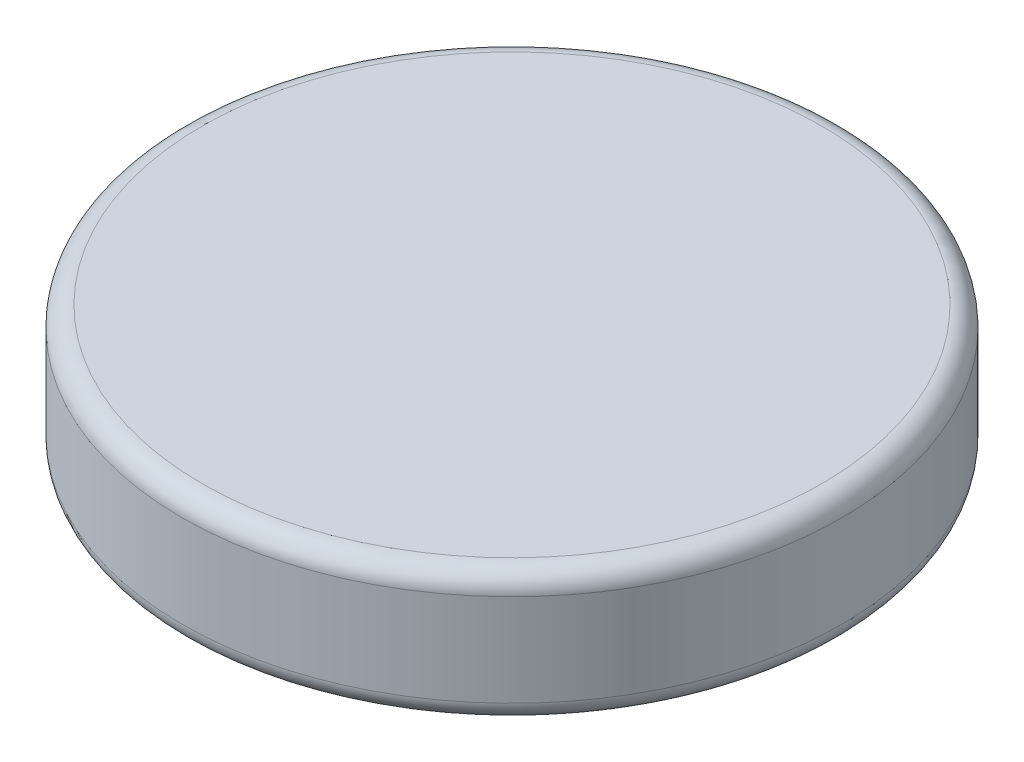
ISO-10303-21;
HEADER;
FILE_DESCRIPTION(('STEP AP214'),'2;1');
FILE_NAME('part.step','',(''),(''),'','','');
FILE_SCHEMA(('AUTOMOTIVE_DESIGN { 1 0 10303 214 1 1 1 1 }'));
ENDSEC;
DATA;
#1=APPLICATION_CONTEXT('core data for automotive mechanical design processes');
#2=APPLICATION_PROTOCOL_DEFINITION('international standard','automotive_design',2000,#1);
#3=PRODUCT_CONTEXT('',#1,'mechanical');
#4=PRODUCT('Part','Part','',(#3));
#5=PRODUCT_RELATED_PRODUCT_CATEGORY('part','',(#4));
#6=PRODUCT_DEFINITION_FORMATION('','',#4);
#7=PRODUCT_DEFINITION_CONTEXT('part definition',#1,'design');
#8=PRODUCT_DEFINITION('design','',#6,#7);
#9=PRODUCT_DEFINITION_SHAPE('','',#8);
#10=(LENGTH_UNIT() NAMED_UNIT(*) SI_UNIT(.MILLI.,.METRE.));
#11=(NAMED_UNIT(*) PLANE_ANGLE_UNIT() SI_UNIT($,.RADIAN.));
#12=(NAMED_UNIT(*) SI_UNIT($,.STERADIAN.) SOLID_ANGLE_UNIT());
#13=UNCERTAINTY_MEASURE_WITH_UNIT(LENGTH_MEASURE(1.E-05),#10,'distance_accuracy_value','');
#14=(GEOMETRIC_REPRESENTATION_CONTEXT(3) GLOBAL_UNCERTAINTY_ASSIGNED_CONTEXT((#13)) GLOBAL_UNIT_ASSIGNED_CONTEXT((#10,
#11,#12)) REPRESENTATION_CONTEXT('',''));
#15=CARTESIAN_POINT('',(0.,0.,0.));
#16=DIRECTION('',(0.,0.,1.));
#17=DIRECTION('',(1.,0.,0.));
#18=AXIS2_PLACEMENT_3D('',#15,#16,#17);
#19=CARTESIAN_POINT('',(0.,2.,0.));
#20=DIRECTION('',(0.,-1.,0.));
#21=DIRECTION('',(0.,0.,-1.));
#22=AXIS2_PLACEMENT_3D('',#19,#20,#21);
#23=CYLINDRICAL_SURFACE('',#22,5.);
#24=CARTESIAN_POINT('',(0.,0.3,0.));
#25=DIRECTION('',(0.,1.,0.));
#26=DIRECTION('',(0.,0.,1.));
#27=AXIS2_PLACEMENT_3D('',#24,#25,#26);
#28=CIRCLE('',#27,5.);
#29=CARTESIAN_POINT('',(0.,0.3,5.));
#30=VERTEX_POINT('',#29);
#31=EDGE_CURVE('E37',#30,#30,#28,.T.);
#32=ORIENTED_EDGE('',*,*,#31,.T.);
#33=EDGE_LOOP('',(#32));
#34=FACE_BOUND('',#33,.T.);
#35=CARTESIAN_POINT('',(0.,1.7,0.));
#36=DIRECTION('',(0.,1.,0.));
#37=DIRECTION('',(0.,0.,1.));
#38=AXIS2_PLACEMENT_3D('',#35,#36,#37);
#39=CIRCLE('',#38,5.);
#40=CARTESIAN_POINT('',(0.,1.7,5.));
#41=VERTEX_POINT('',#40);
#42=EDGE_CURVE('E41',#41,#41,#39,.F.);
#43=ORIENTED_EDGE('',*,*,#42,.T.);
#44=EDGE_LOOP('',(#43));
#45=FACE_BOUND('',#44,.T.);
#46=ADVANCED_FACE('F30',(#34,#45),#23,.T.);
#47=CARTESIAN_POINT('',(0.,2.,0.));
#48=DIRECTION('',(0.,1.,0.));
#49=DIRECTION('',(0.,0.,1.));
#50=AXIS2_PLACEMENT_3D('',#47,#48,#49);
#51=PLANE('',#50);
#52=CARTESIAN_POINT('',(0.,2.,0.));
#53=DIRECTION('',(0.,1.,0.));
#54=DIRECTION('',(0.,0.,1.));
#55=AXIS2_PLACEMENT_3D('',#52,#53,#54);
#56=CIRCLE('',#55,4.7);
#57=CARTESIAN_POINT('',(0.,2.,4.7));
#58=VERTEX_POINT('',#57);
#59=EDGE_CURVE('E45',#58,#58,#56,.T.);
#60=ORIENTED_EDGE('',*,*,#59,.T.);
#61=EDGE_LOOP('',(#60));
#62=FACE_BOUND('',#61,.T.);
#63=ADVANCED_FACE('F51',(#62),#51,.T.);
#64=CARTESIAN_POINT('',(0.,0.,0.));
#65=DIRECTION('',(0.,1.,0.));
#66=DIRECTION('',(0.,0.,1.));
#67=AXIS2_PLACEMENT_3D('',#64,#65,#66);
#68=PLANE('',#67);
#69=CARTESIAN_POINT('',(0.,0.,0.));
#70=DIRECTION('',(0.,1.,0.));
#71=DIRECTION('',(0.,0.,1.));
#72=AXIS2_PLACEMENT_3D('',#69,#70,#71);
#73=CIRCLE('',#72,4.7);
#74=CARTESIAN_POINT('',(0.,0.,4.7));
#75=VERTEX_POINT('',#74);
#76=EDGE_CURVE('E10',#75,#75,#73,.F.);
#77=ORIENTED_EDGE('',*,*,#76,.T.);
#78=EDGE_LOOP('',(#77));
#79=FACE_BOUND('',#78,.T.);
#80=ADVANCED_FACE('F55',(#79),#68,.F.);
#81=CARTESIAN_POINT('',(0.,1.7,0.));
#82=DIRECTION('',(0.,1.,0.));
#83=DIRECTION('',(0.,0.,1.));
#84=AXIS2_PLACEMENT_3D('',#81,#82,#83);
#85=TOROIDAL_SURFACE('',#84,4.7,0.3);
#86=ORIENTED_EDGE('',*,*,#42,.F.);
#87=EDGE_LOOP('',(#86));
#88=FACE_BOUND('',#87,.T.);
#89=ORIENTED_EDGE('',*,*,#59,.F.);
#90=EDGE_LOOP('',(#89));
#91=FACE_BOUND('',#90,.T.);
#92=ADVANCED_FACE('F53',(#88,#91),#85,.T.);
#93=CARTESIAN_POINT('',(0.,0.3,0.));
#94=DIRECTION('',(0.,1.,0.));
#95=DIRECTION('',(0.,0.,1.));
#96=AXIS2_PLACEMENT_3D('',#93,#94,#95);
#97=TOROIDAL_SURFACE('',#96,4.7,0.3);
#98=ORIENTED_EDGE('',*,*,#76,.F.);
#99=EDGE_LOOP('',(#98));
#100=FACE_BOUND('',#99,.T.);
#101=ORIENTED_EDGE('',*,*,#31,.F.);
#102=EDGE_LOOP('',(#101));
#103=FACE_BOUND('',#102,.T.);
#104=ADVANCED_FACE('F32',(#100,#103),#97,.T.);
#105=CLOSED_SHELL('',(#46,#63,#80,#92,#104));
#106=MANIFOLD_SOLID_BREP('B2',#105);
#107=ADVANCED_BREP_SHAPE_REPRESENTATION('',(#18,#106),#14);
#108=SHAPE_DEFINITION_REPRESENTATION(#9,#107);
ENDSEC;
END-ISO-10303-21;
